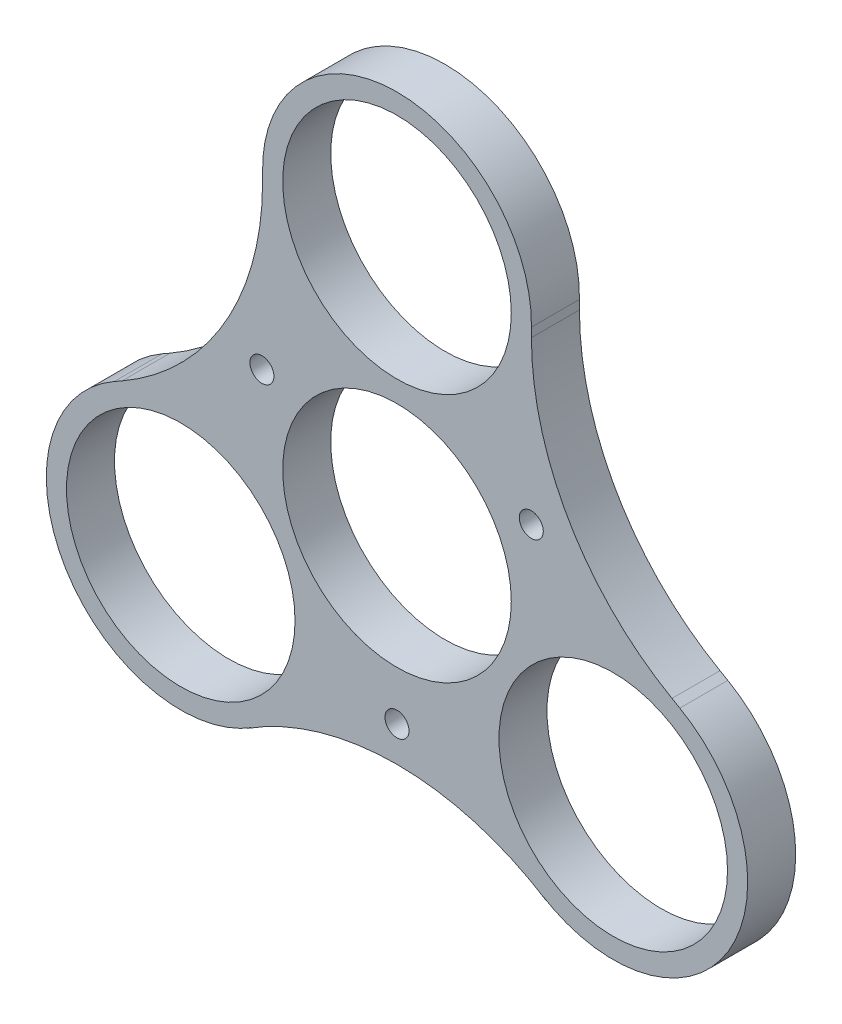
ISO-10303-21;
HEADER;
FILE_DESCRIPTION(('STEP AP214'),'2;1');
FILE_NAME('part.step','',(''),(''),'','','');
FILE_SCHEMA(('AUTOMOTIVE_DESIGN { 1 0 10303 214 1 1 1 1 }'));
ENDSEC;
DATA;
#1=APPLICATION_CONTEXT('core data for automotive mechanical design processes');
#2=APPLICATION_PROTOCOL_DEFINITION('international standard','automotive_design',2000,#1);
#3=PRODUCT_CONTEXT('',#1,'mechanical');
#4=PRODUCT('Part','Part','',(#3));
#5=PRODUCT_RELATED_PRODUCT_CATEGORY('part','',(#4));
#6=PRODUCT_DEFINITION_FORMATION('','',#4);
#7=PRODUCT_DEFINITION_CONTEXT('part definition',#1,'design');
#8=PRODUCT_DEFINITION('design','',#6,#7);
#9=PRODUCT_DEFINITION_SHAPE('','',#8);
#10=(LENGTH_UNIT() NAMED_UNIT(*) SI_UNIT(.MILLI.,.METRE.));
#11=(NAMED_UNIT(*) PLANE_ANGLE_UNIT() SI_UNIT($,.RADIAN.));
#12=(NAMED_UNIT(*) SI_UNIT($,.STERADIAN.) SOLID_ANGLE_UNIT());
#13=UNCERTAINTY_MEASURE_WITH_UNIT(LENGTH_MEASURE(1.E-05),#10,'distance_accuracy_value','');
#14=(GEOMETRIC_REPRESENTATION_CONTEXT(3) GLOBAL_UNCERTAINTY_ASSIGNED_CONTEXT((#13)) GLOBAL_UNIT_ASSIGNED_CONTEXT((#10,
#11,#12)) REPRESENTATION_CONTEXT('',''));
#15=CARTESIAN_POINT('',(0.,0.,0.));
#16=DIRECTION('',(0.,0.,1.));
#17=DIRECTION('',(1.,0.,0.));
#18=AXIS2_PLACEMENT_3D('',#15,#16,#17);
#19=CARTESIAN_POINT('',(0.,26.,2.5));
#20=DIRECTION('',(0.,0.,1.));
#21=DIRECTION('',(1.,0.,0.));
#22=AXIS2_PLACEMENT_3D('',#19,#20,#21);
#23=PLANE('',#22);
#24=CARTESIAN_POINT('',(0.,-17.,2.5));
#25=DIRECTION('',(0.,0.,1.));
#26=DIRECTION('',(1.,0.,0.));
#27=AXIS2_PLACEMENT_3D('',#24,#25,#26);
#28=CIRCLE('',#27,1.25);
#29=CARTESIAN_POINT('',(1.25,-17.,2.5));
#30=VERTEX_POINT('',#29);
#31=EDGE_CURVE('E303',#30,#30,#28,.T.);
#32=ORIENTED_EDGE('',*,*,#31,.F.);
#33=EDGE_LOOP('',(#32));
#34=FACE_BOUND('',#33,.T.);
#35=CARTESIAN_POINT('',(-22.5166604983954,-13.,2.5));
#36=DIRECTION('',(0.,0.,1.));
#37=DIRECTION('',(1.,0.,0.));
#38=AXIS2_PLACEMENT_3D('',#35,#36,#37);
#39=CIRCLE('',#38,11.9);
#40=CARTESIAN_POINT('',(-10.6166604983954,-13.,2.5));
#41=VERTEX_POINT('',#40);
#42=EDGE_CURVE('E315',#41,#41,#39,.T.);
#43=ORIENTED_EDGE('',*,*,#42,.F.);
#44=EDGE_LOOP('',(#43));
#45=FACE_BOUND('',#44,.T.);
#46=CARTESIAN_POINT('',(0.,26.,2.5));
#47=DIRECTION('',(0.,0.,1.));
#48=DIRECTION('',(1.,0.,0.));
#49=AXIS2_PLACEMENT_3D('',#46,#47,#48);
#50=CIRCLE('',#49,11.9);
#51=CARTESIAN_POINT('',(11.9,26.,2.5));
#52=VERTEX_POINT('',#51);
#53=EDGE_CURVE('E327',#52,#52,#50,.T.);
#54=ORIENTED_EDGE('',*,*,#53,.F.);
#55=EDGE_LOOP('',(#54));
#56=FACE_BOUND('',#55,.T.);
#57=CARTESIAN_POINT('',(0.,26.,2.5));
#58=DIRECTION('',(0.,0.,1.));
#59=DIRECTION('',(1.,0.,0.));
#60=AXIS2_PLACEMENT_3D('',#57,#58,#59);
#61=CIRCLE('',#60,14.);
#62=CARTESIAN_POINT('',(13.9984050341273,25.7886791526654,2.5));
#63=VERTEX_POINT('',#62);
#64=CARTESIAN_POINT('',(-13.9956292521166,25.650197430972,2.5));
#65=VERTEX_POINT('',#64);
#66=EDGE_CURVE('E177',#63,#65,#61,.T.);
#67=ORIENTED_EDGE('',*,*,#66,.T.);
#68=DIRECTION('',(-0.00391583470663836,-0.999992333089884,0.));
#69=VECTOR('',#68,1.);
#70=CARTESIAN_POINT('',(-13.9993244776974,24.7065423671787,2.5));
#71=LINE('',#70,#69);
#72=CARTESIAN_POINT('',(-13.9993244776975,24.7065423671787,2.5));
#73=VERTEX_POINT('',#72);
#74=EDGE_CURVE('E105',#65,#73,#71,.T.);
#75=ORIENTED_EDGE('',*,*,#74,.T.);
#76=CARTESIAN_POINT('',(-42.9991021373041,24.8201015736713,2.5));
#77=DIRECTION('',(0.,0.,-1.));
#78=DIRECTION('',(1.,0.,0.));
#79=AXIS2_PLACEMENT_3D('',#76,#77,#78);
#80=CIRCLE('',#79,29.);
#81=CARTESIAN_POINT('',(-28.6325234341284,-0.371194867073002,2.5));
#82=VERTEX_POINT('',#81);
#83=EDGE_CURVE('E204',#73,#82,#80,.T.);
#84=ORIENTED_EDGE('',*,*,#83,.T.);
#85=DIRECTION('',(-0.868665394508427,-0.495399265626746,0.));
#86=VECTOR('',#85,1.);
#87=CARTESIAN_POINT('',(-28.6325234341284,-0.371194867073002,2.5));
#88=LINE('',#87,#86);
#89=CARTESIAN_POINT('',(-29.4522502171699,-0.838684476881986,2.5));
#90=VERTEX_POINT('',#89);
#91=EDGE_CURVE('E223',#82,#90,#88,.T.);
#92=ORIENTED_EDGE('',*,*,#91,.T.);
#93=CARTESIAN_POINT('',(-22.5166604983954,-13.,2.5));
#94=DIRECTION('',(0.,0.,1.));
#95=DIRECTION('',(1.,0.,0.));
#96=AXIS2_PLACEMENT_3D('',#93,#94,#95);
#97=CIRCLE('',#96,14.);
#98=CARTESIAN_POINT('',(-14.9925927673296,-24.8062866633982,2.5));
#99=VERTEX_POINT('',#98);
#100=EDGE_CURVE('E220',#90,#99,#97,.T.);
#101=ORIENTED_EDGE('',*,*,#100,.T.);
#102=DIRECTION('',(-0.843306190242789,-0.537433409361749,0.));
#103=VECTOR('',#102,1.);
#104=CARTESIAN_POINT('',(-15.5855688714911,-25.1841863788477,2.5));
#105=LINE('',#104,#103);
#106=CARTESIAN_POINT('',(-15.5855688714911,-25.1841863788477,2.5));
#107=VERTEX_POINT('',#106);
#108=EDGE_CURVE('E222',#99,#107,#105,.T.);
#109=ORIENTED_EDGE('',*,*,#108,.T.);
#110=CARTESIAN_POINT('',(0.,-49.6400658958884,2.5));
#111=DIRECTION('',(0.,0.,-1.));
#112=DIRECTION('',(-1.,0.,0.));
#113=AXIS2_PLACEMENT_3D('',#110,#111,#112);
#114=CIRCLE('',#113,29.0000000000001);
#115=CARTESIAN_POINT('',(15.5855688714911,-25.1841863788477,2.5));
#116=VERTEX_POINT('',#115);
#117=EDGE_CURVE('E225',#107,#116,#114,.T.);
#118=ORIENTED_EDGE('',*,*,#117,.T.);
#119=DIRECTION('',(-0.843306190242782,0.53743340936176,0.));
#120=VECTOR('',#119,1.);
#121=CARTESIAN_POINT('',(15.5855688714911,-25.1841863788477,2.5));
#122=LINE('',#121,#120);
#123=CARTESIAN_POINT('',(14.9925927673308,-24.8062866633989,2.5));
#124=VERTEX_POINT('',#123);
#125=EDGE_CURVE('E231',#116,#124,#122,.T.);
#126=ORIENTED_EDGE('',*,*,#125,.T.);
#127=CARTESIAN_POINT('',(22.5166604983954,-12.9999999999999,2.5));
#128=DIRECTION('',(0.,0.,1.));
#129=DIRECTION('',(1.,0.,0.));
#130=AXIS2_PLACEMENT_3D('',#127,#128,#129);
#131=CIRCLE('',#130,14.);
#132=CARTESIAN_POINT('',(29.4517705843719,-0.838410955167509,2.5));
#133=VERTEX_POINT('',#132);
#134=EDGE_CURVE('E136',#124,#133,#131,.T.);
#135=ORIENTED_EDGE('',*,*,#134,.T.);
#136=DIRECTION('',(-0.868684931773746,0.495365006141171,0.));
#137=VECTOR('',#136,1.);
#138=CARTESIAN_POINT('',(28.6320253647497,-0.370953674743447,2.5));
#139=LINE('',#138,#137);
#140=CARTESIAN_POINT('',(28.6320253647497,-0.370953674743456,2.5));
#141=VERTEX_POINT('',#140);
#142=EDGE_CURVE('E130',#133,#141,#139,.T.);
#143=ORIENTED_EDGE('',*,*,#142,.T.);
#144=CARTESIAN_POINT('',(42.9976105428437,24.8209093466952,2.5));
#145=DIRECTION('',(0.,0.,-1.));
#146=DIRECTION('',(-1.,0.,0.));
#147=AXIS2_PLACEMENT_3D('',#144,#145,#146);
#148=CIRCLE('',#147,29.);
#149=CARTESIAN_POINT('',(13.9976205633218,24.8450171799652,2.5));
#150=VERTEX_POINT('',#149);
#151=EDGE_CURVE('E134',#141,#150,#148,.T.);
#152=ORIENTED_EDGE('',*,*,#151,.T.);
#153=DIRECTION('',(0.000831304595519707,0.999999654466275,0.));
#154=VECTOR('',#153,1.);
#155=CARTESIAN_POINT('',(13.9984050341273,25.7886791526654,2.5));
#156=LINE('',#155,#154);
#157=EDGE_CURVE('E50',#150,#63,#156,.T.);
#158=ORIENTED_EDGE('',*,*,#157,.T.);
#159=EDGE_LOOP('',(#67,#75,#84,#92,#101,#109,#118,#126,#135,#143,#152,#158));
#160=FACE_BOUND('',#159,.T.);
#161=CARTESIAN_POINT('',(0.,0.,2.5));
#162=DIRECTION('',(0.,0.,1.));
#163=DIRECTION('',(1.,0.,0.));
#164=AXIS2_PLACEMENT_3D('',#161,#162,#163);
#165=CIRCLE('',#164,11.9);
#166=CARTESIAN_POINT('',(11.9,0.,2.5));
#167=VERTEX_POINT('',#166);
#168=EDGE_CURVE('E158',#167,#167,#165,.T.);
#169=ORIENTED_EDGE('',*,*,#168,.F.);
#170=EDGE_LOOP('',(#169));
#171=FACE_BOUND('',#170,.T.);
#172=CARTESIAN_POINT('',(22.5166604983954,-12.9999999999999,2.5));
#173=DIRECTION('',(0.,0.,1.));
#174=DIRECTION('',(1.,0.,0.));
#175=AXIS2_PLACEMENT_3D('',#172,#173,#174);
#176=CIRCLE('',#175,11.9);
#177=CARTESIAN_POINT('',(34.4166604983955,-12.9999999999999,2.5));
#178=VERTEX_POINT('',#177);
#179=EDGE_CURVE('E321',#178,#178,#176,.T.);
#180=ORIENTED_EDGE('',*,*,#179,.F.);
#181=EDGE_LOOP('',(#180));
#182=FACE_BOUND('',#181,.T.);
#183=CARTESIAN_POINT('',(13.9836024759587,7.98226603570782,2.5));
#184=DIRECTION('',(0.,0.,1.));
#185=DIRECTION('',(1.,0.,0.));
#186=AXIS2_PLACEMENT_3D('',#183,#184,#185);
#187=CIRCLE('',#186,1.25);
#188=CARTESIAN_POINT('',(15.2336024759587,7.98226603570782,2.5));
#189=VERTEX_POINT('',#188);
#190=EDGE_CURVE('E309',#189,#189,#187,.T.);
#191=ORIENTED_EDGE('',*,*,#190,.F.);
#192=EDGE_LOOP('',(#191));
#193=FACE_BOUND('',#192,.T.);
#194=CARTESIAN_POINT('',(-14.064993078424,7.93665748417124,2.5));
#195=DIRECTION('',(0.,0.,1.));
#196=DIRECTION('',(1.,0.,0.));
#197=AXIS2_PLACEMENT_3D('',#194,#195,#196);
#198=CIRCLE('',#197,1.25);
#199=CARTESIAN_POINT('',(-12.814993078424,7.93665748417124,2.5));
#200=VERTEX_POINT('',#199);
#201=EDGE_CURVE('E294',#200,#200,#198,.T.);
#202=ORIENTED_EDGE('',*,*,#201,.F.);
#203=EDGE_LOOP('',(#202));
#204=FACE_BOUND('',#203,.T.);
#205=ADVANCED_FACE('F33',(#34,#45,#56,#160,#171,#182,#193,#204),#23,.T.);
#206=CARTESIAN_POINT('',(0.,26.,-2.5));
#207=DIRECTION('',(0.,0.,1.));
#208=DIRECTION('',(1.,0.,0.));
#209=AXIS2_PLACEMENT_3D('',#206,#207,#208);
#210=PLANE('',#209);
#211=CARTESIAN_POINT('',(0.,26.,-2.5));
#212=DIRECTION('',(0.,0.,1.));
#213=DIRECTION('',(1.,0.,0.));
#214=AXIS2_PLACEMENT_3D('',#211,#212,#213);
#215=CIRCLE('',#214,14.);
#216=CARTESIAN_POINT('',(13.9984050341273,25.7886791526654,-2.5));
#217=VERTEX_POINT('',#216);
#218=CARTESIAN_POINT('',(-13.9956292521166,25.650197430972,-2.5));
#219=VERTEX_POINT('',#218);
#220=EDGE_CURVE('E154',#217,#219,#215,.T.);
#221=ORIENTED_EDGE('',*,*,#220,.F.);
#222=DIRECTION('',(0.000831304595519707,0.999999654466275,0.));
#223=VECTOR('',#222,1.);
#224=CARTESIAN_POINT('',(13.9984050341273,25.7886791526654,-2.5));
#225=LINE('',#224,#223);
#226=CARTESIAN_POINT('',(13.9976205633218,24.8450171799652,-2.5));
#227=VERTEX_POINT('',#226);
#228=EDGE_CURVE('E97',#227,#217,#225,.T.);
#229=ORIENTED_EDGE('',*,*,#228,.F.);
#230=CARTESIAN_POINT('',(42.9976105428437,24.8209093466952,-2.5));
#231=DIRECTION('',(0.,0.,-1.));
#232=DIRECTION('',(-1.,0.,0.));
#233=AXIS2_PLACEMENT_3D('',#230,#231,#232);
#234=CIRCLE('',#233,29.);
#235=CARTESIAN_POINT('',(28.6320253647497,-0.370953674743456,-2.5));
#236=VERTEX_POINT('',#235);
#237=EDGE_CURVE('E91',#236,#227,#234,.T.);
#238=ORIENTED_EDGE('',*,*,#237,.F.);
#239=DIRECTION('',(-0.868684931773746,0.495365006141171,0.));
#240=VECTOR('',#239,1.);
#241=CARTESIAN_POINT('',(28.6320253647497,-0.370953674743447,-2.5));
#242=LINE('',#241,#240);
#243=CARTESIAN_POINT('',(29.4517705843719,-0.838410955167509,-2.5));
#244=VERTEX_POINT('',#243);
#245=EDGE_CURVE('E144',#244,#236,#242,.T.);
#246=ORIENTED_EDGE('',*,*,#245,.F.);
#247=CARTESIAN_POINT('',(22.5166604983954,-12.9999999999999,-2.5));
#248=DIRECTION('',(0.,0.,1.));
#249=DIRECTION('',(1.,0.,0.));
#250=AXIS2_PLACEMENT_3D('',#247,#248,#249);
#251=CIRCLE('',#250,14.);
#252=CARTESIAN_POINT('',(14.9925927673308,-24.8062866633989,-2.5));
#253=VERTEX_POINT('',#252);
#254=EDGE_CURVE('E172',#253,#244,#251,.T.);
#255=ORIENTED_EDGE('',*,*,#254,.F.);
#256=DIRECTION('',(-0.843306190242782,0.53743340936176,0.));
#257=VECTOR('',#256,1.);
#258=CARTESIAN_POINT('',(15.5855688714911,-25.1841863788477,-2.5));
#259=LINE('',#258,#257);
#260=CARTESIAN_POINT('',(15.5855688714911,-25.1841863788477,-2.5));
#261=VERTEX_POINT('',#260);
#262=EDGE_CURVE('E170',#261,#253,#259,.T.);
#263=ORIENTED_EDGE('',*,*,#262,.F.);
#264=CARTESIAN_POINT('',(0.,-49.6400658958884,-2.5));
#265=DIRECTION('',(0.,0.,-1.));
#266=DIRECTION('',(-1.,0.,0.));
#267=AXIS2_PLACEMENT_3D('',#264,#265,#266);
#268=CIRCLE('',#267,29.0000000000001);
#269=CARTESIAN_POINT('',(-15.5855688714911,-25.1841863788477,-2.5));
#270=VERTEX_POINT('',#269);
#271=EDGE_CURVE('E168',#270,#261,#268,.T.);
#272=ORIENTED_EDGE('',*,*,#271,.F.);
#273=DIRECTION('',(-0.843306190242789,-0.537433409361749,0.));
#274=VECTOR('',#273,1.);
#275=CARTESIAN_POINT('',(-15.5855688714911,-25.1841863788477,-2.5));
#276=LINE('',#275,#274);
#277=CARTESIAN_POINT('',(-14.9925927673296,-24.8062866633982,-2.5));
#278=VERTEX_POINT('',#277);
#279=EDGE_CURVE('E166',#278,#270,#276,.T.);
#280=ORIENTED_EDGE('',*,*,#279,.F.);
#281=CARTESIAN_POINT('',(-22.5166604983954,-13.,-2.5));
#282=DIRECTION('',(0.,0.,1.));
#283=DIRECTION('',(1.,0.,0.));
#284=AXIS2_PLACEMENT_3D('',#281,#282,#283);
#285=CIRCLE('',#284,14.);
#286=CARTESIAN_POINT('',(-29.4522502171699,-0.838684476881986,-2.5));
#287=VERTEX_POINT('',#286);
#288=EDGE_CURVE('E164',#287,#278,#285,.T.);
#289=ORIENTED_EDGE('',*,*,#288,.F.);
#290=DIRECTION('',(-0.868665394508427,-0.495399265626746,0.));
#291=VECTOR('',#290,1.);
#292=CARTESIAN_POINT('',(-28.6325234341284,-0.371194867073002,-2.5));
#293=LINE('',#292,#291);
#294=CARTESIAN_POINT('',(-28.6325234341284,-0.371194867073002,-2.5));
#295=VERTEX_POINT('',#294);
#296=EDGE_CURVE('E162',#295,#287,#293,.T.);
#297=ORIENTED_EDGE('',*,*,#296,.F.);
#298=CARTESIAN_POINT('',(-42.9991021373041,24.8201015736713,-2.5));
#299=DIRECTION('',(0.,0.,-1.));
#300=DIRECTION('',(1.,0.,0.));
#301=AXIS2_PLACEMENT_3D('',#298,#299,#300);
#302=CIRCLE('',#301,29.);
#303=CARTESIAN_POINT('',(-13.9993244776975,24.7065423671787,-2.5));
#304=VERTEX_POINT('',#303);
#305=EDGE_CURVE('E160',#304,#295,#302,.T.);
#306=ORIENTED_EDGE('',*,*,#305,.F.);
#307=DIRECTION('',(-0.00391583470663836,-0.999992333089884,0.));
#308=VECTOR('',#307,1.);
#309=CARTESIAN_POINT('',(-13.9993244776974,24.7065423671787,-2.5));
#310=LINE('',#309,#308);
#311=EDGE_CURVE('E157',#219,#304,#310,.T.);
#312=ORIENTED_EDGE('',*,*,#311,.F.);
#313=EDGE_LOOP('',(#221,#229,#238,#246,#255,#263,#272,#280,#289,#297,#306,#312));
#314=FACE_BOUND('',#313,.T.);
#315=CARTESIAN_POINT('',(0.,0.,-2.5));
#316=DIRECTION('',(0.,0.,1.));
#317=DIRECTION('',(1.,0.,0.));
#318=AXIS2_PLACEMENT_3D('',#315,#316,#317);
#319=CIRCLE('',#318,11.9);
#320=CARTESIAN_POINT('',(11.9,0.,-2.5));
#321=VERTEX_POINT('',#320);
#322=EDGE_CURVE('E330',#321,#321,#319,.T.);
#323=ORIENTED_EDGE('',*,*,#322,.T.);
#324=EDGE_LOOP('',(#323));
#325=FACE_BOUND('',#324,.T.);
#326=CARTESIAN_POINT('',(0.,26.,-2.5));
#327=DIRECTION('',(0.,0.,1.));
#328=DIRECTION('',(1.,0.,0.));
#329=AXIS2_PLACEMENT_3D('',#326,#327,#328);
#330=CIRCLE('',#329,11.9);
#331=CARTESIAN_POINT('',(11.9,26.,-2.5));
#332=VERTEX_POINT('',#331);
#333=EDGE_CURVE('E324',#332,#332,#330,.T.);
#334=ORIENTED_EDGE('',*,*,#333,.T.);
#335=EDGE_LOOP('',(#334));
#336=FACE_BOUND('',#335,.T.);
#337=CARTESIAN_POINT('',(22.5166604983954,-12.9999999999999,-2.5));
#338=DIRECTION('',(0.,0.,1.));
#339=DIRECTION('',(1.,0.,0.));
#340=AXIS2_PLACEMENT_3D('',#337,#338,#339);
#341=CIRCLE('',#340,11.9);
#342=CARTESIAN_POINT('',(34.4166604983955,-12.9999999999999,-2.5));
#343=VERTEX_POINT('',#342);
#344=EDGE_CURVE('E318',#343,#343,#341,.T.);
#345=ORIENTED_EDGE('',*,*,#344,.T.);
#346=EDGE_LOOP('',(#345));
#347=FACE_BOUND('',#346,.T.);
#348=CARTESIAN_POINT('',(-22.5166604983954,-13.,-2.5));
#349=DIRECTION('',(0.,0.,1.));
#350=DIRECTION('',(1.,0.,0.));
#351=AXIS2_PLACEMENT_3D('',#348,#349,#350);
#352=CIRCLE('',#351,11.9);
#353=CARTESIAN_POINT('',(-10.6166604983954,-13.,-2.5));
#354=VERTEX_POINT('',#353);
#355=EDGE_CURVE('E312',#354,#354,#352,.T.);
#356=ORIENTED_EDGE('',*,*,#355,.T.);
#357=EDGE_LOOP('',(#356));
#358=FACE_BOUND('',#357,.T.);
#359=CARTESIAN_POINT('',(13.9836024759587,7.98226603570782,-2.5));
#360=DIRECTION('',(0.,0.,1.));
#361=DIRECTION('',(1.,0.,0.));
#362=AXIS2_PLACEMENT_3D('',#359,#360,#361);
#363=CIRCLE('',#362,1.25);
#364=CARTESIAN_POINT('',(15.2336024759587,7.98226603570782,-2.5));
#365=VERTEX_POINT('',#364);
#366=EDGE_CURVE('E306',#365,#365,#363,.T.);
#367=ORIENTED_EDGE('',*,*,#366,.T.);
#368=EDGE_LOOP('',(#367));
#369=FACE_BOUND('',#368,.T.);
#370=CARTESIAN_POINT('',(0.,-17.,-2.5));
#371=DIRECTION('',(0.,0.,1.));
#372=DIRECTION('',(1.,0.,0.));
#373=AXIS2_PLACEMENT_3D('',#370,#371,#372);
#374=CIRCLE('',#373,1.25);
#375=CARTESIAN_POINT('',(1.25,-17.,-2.5));
#376=VERTEX_POINT('',#375);
#377=EDGE_CURVE('E300',#376,#376,#374,.T.);
#378=ORIENTED_EDGE('',*,*,#377,.T.);
#379=EDGE_LOOP('',(#378));
#380=FACE_BOUND('',#379,.T.);
#381=CARTESIAN_POINT('',(-14.064993078424,7.93665748417124,-2.5));
#382=DIRECTION('',(0.,0.,1.));
#383=DIRECTION('',(1.,0.,0.));
#384=AXIS2_PLACEMENT_3D('',#381,#382,#383);
#385=CIRCLE('',#384,1.25);
#386=CARTESIAN_POINT('',(-12.814993078424,7.93665748417124,-2.5));
#387=VERTEX_POINT('',#386);
#388=EDGE_CURVE('E297',#387,#387,#385,.T.);
#389=ORIENTED_EDGE('',*,*,#388,.T.);
#390=EDGE_LOOP('',(#389));
#391=FACE_BOUND('',#390,.T.);
#392=ADVANCED_FACE('F208',(#314,#325,#336,#347,#358,#369,#380,#391),#210,.F.);
#393=CARTESIAN_POINT('',(0.,26.,2.5));
#394=DIRECTION('',(0.,0.,-1.));
#395=DIRECTION('',(-1.,0.,0.));
#396=AXIS2_PLACEMENT_3D('',#393,#394,#395);
#397=CYLINDRICAL_SURFACE('',#396,14.);
#398=ORIENTED_EDGE('',*,*,#220,.T.);
#399=DIRECTION('',(0.,0.,-1.));
#400=VECTOR('',#399,1.);
#401=CARTESIAN_POINT('',(-13.9956292521166,25.650197430972,2.5));
#402=LINE('',#401,#400);
#403=EDGE_CURVE('E11',#65,#219,#402,.T.);
#404=ORIENTED_EDGE('',*,*,#403,.F.);
#405=ORIENTED_EDGE('',*,*,#66,.F.);
#406=DIRECTION('',(0.,0.,-1.));
#407=VECTOR('',#406,1.);
#408=CARTESIAN_POINT('',(13.9984050341273,25.7886791526654,2.5));
#409=LINE('',#408,#407);
#410=EDGE_CURVE('E150',#63,#217,#409,.T.);
#411=ORIENTED_EDGE('',*,*,#410,.T.);
#412=EDGE_LOOP('',(#398,#404,#405,#411));
#413=FACE_BOUND('',#412,.T.);
#414=ADVANCED_FACE('F35',(#413),#397,.T.);
#415=CARTESIAN_POINT('',(-13.9993244776974,24.7065423671787,2.5));
#416=DIRECTION('',(0.999992333089884,-0.00391583470663836,0.));
#417=DIRECTION('',(0.00391583470663836,0.999992333089885,0.));
#418=AXIS2_PLACEMENT_3D('',#415,#416,#417);
#419=PLANE('',#418);
#420=ORIENTED_EDGE('',*,*,#311,.T.);
#421=DIRECTION('',(0.,0.,-1.));
#422=VECTOR('',#421,1.);
#423=CARTESIAN_POINT('',(-13.9993244776975,24.7065423671787,2.5));
#424=LINE('',#423,#422);
#425=EDGE_CURVE('E42',#73,#304,#424,.T.);
#426=ORIENTED_EDGE('',*,*,#425,.F.);
#427=ORIENTED_EDGE('',*,*,#74,.F.);
#428=ORIENTED_EDGE('',*,*,#403,.T.);
#429=EDGE_LOOP('',(#420,#426,#427,#428));
#430=FACE_BOUND('',#429,.T.);
#431=ADVANCED_FACE('F467',(#430),#419,.F.);
#432=CARTESIAN_POINT('',(-42.9991021373041,24.8201015736713,2.5));
#433=DIRECTION('',(0.,0.,-1.));
#434=DIRECTION('',(-1.,0.,0.));
#435=AXIS2_PLACEMENT_3D('',#432,#433,#434);
#436=CYLINDRICAL_SURFACE('',#435,29.);
#437=ORIENTED_EDGE('',*,*,#305,.T.);
#438=DIRECTION('',(0.,0.,-1.));
#439=VECTOR('',#438,1.);
#440=CARTESIAN_POINT('',(-28.6325234341284,-0.371194867073002,2.5));
#441=LINE('',#440,#439);
#442=EDGE_CURVE('E196',#82,#295,#441,.T.);
#443=ORIENTED_EDGE('',*,*,#442,.F.);
#444=ORIENTED_EDGE('',*,*,#83,.F.);
#445=ORIENTED_EDGE('',*,*,#425,.T.);
#446=EDGE_LOOP('',(#437,#443,#444,#445));
#447=FACE_BOUND('',#446,.T.);
#448=ADVANCED_FACE('F202',(#447),#436,.F.);
#449=CARTESIAN_POINT('',(-28.6325234341284,-0.371194867073002,2.5));
#450=DIRECTION('',(0.495399265626746,-0.868665394508427,0.));
#451=DIRECTION('',(0.868665394508427,0.495399265626746,0.));
#452=AXIS2_PLACEMENT_3D('',#449,#450,#451);
#453=PLANE('',#452);
#454=ORIENTED_EDGE('',*,*,#296,.T.);
#455=DIRECTION('',(0.,0.,-1.));
#456=VECTOR('',#455,1.);
#457=CARTESIAN_POINT('',(-29.4522502171699,-0.838684476881986,2.5));
#458=LINE('',#457,#456);
#459=EDGE_CURVE('E193',#90,#287,#458,.T.);
#460=ORIENTED_EDGE('',*,*,#459,.F.);
#461=ORIENTED_EDGE('',*,*,#91,.F.);
#462=ORIENTED_EDGE('',*,*,#442,.T.);
#463=EDGE_LOOP('',(#454,#460,#461,#462));
#464=FACE_BOUND('',#463,.T.);
#465=ADVANCED_FACE('F214',(#464),#453,.F.);
#466=CARTESIAN_POINT('',(-22.5166604983954,-13.,2.5));
#467=DIRECTION('',(0.,0.,-1.));
#468=DIRECTION('',(-1.,0.,0.));
#469=AXIS2_PLACEMENT_3D('',#466,#467,#468);
#470=CYLINDRICAL_SURFACE('',#469,14.);
#471=ORIENTED_EDGE('',*,*,#288,.T.);
#472=DIRECTION('',(0.,0.,-1.));
#473=VECTOR('',#472,1.);
#474=CARTESIAN_POINT('',(-14.9925927673296,-24.8062866633982,2.5));
#475=LINE('',#474,#473);
#476=EDGE_CURVE('E190',#99,#278,#475,.T.);
#477=ORIENTED_EDGE('',*,*,#476,.F.);
#478=ORIENTED_EDGE('',*,*,#100,.F.);
#479=ORIENTED_EDGE('',*,*,#459,.T.);
#480=EDGE_LOOP('',(#471,#477,#478,#479));
#481=FACE_BOUND('',#480,.T.);
#482=ADVANCED_FACE('F218',(#481),#470,.T.);
#483=CARTESIAN_POINT('',(-15.5855688714911,-25.1841863788477,2.5));
#484=DIRECTION('',(0.537433409361749,-0.843306190242789,0.));
#485=DIRECTION('',(0.843306190242789,0.537433409361749,0.));
#486=AXIS2_PLACEMENT_3D('',#483,#484,#485);
#487=PLANE('',#486);
#488=ORIENTED_EDGE('',*,*,#279,.T.);
#489=DIRECTION('',(0.,0.,-1.));
#490=VECTOR('',#489,1.);
#491=CARTESIAN_POINT('',(-15.5855688714911,-25.1841863788477,2.5));
#492=LINE('',#491,#490);
#493=EDGE_CURVE('E187',#107,#270,#492,.T.);
#494=ORIENTED_EDGE('',*,*,#493,.F.);
#495=ORIENTED_EDGE('',*,*,#108,.F.);
#496=ORIENTED_EDGE('',*,*,#476,.T.);
#497=EDGE_LOOP('',(#488,#494,#495,#496));
#498=FACE_BOUND('',#497,.T.);
#499=ADVANCED_FACE('F432',(#498),#487,.F.);
#500=CARTESIAN_POINT('',(0.,-49.6400658958884,2.5));
#501=DIRECTION('',(0.,0.,-1.));
#502=DIRECTION('',(-1.,0.,0.));
#503=AXIS2_PLACEMENT_3D('',#500,#501,#502);
#504=CYLINDRICAL_SURFACE('',#503,29.0000000000001);
#505=ORIENTED_EDGE('',*,*,#271,.T.);
#506=DIRECTION('',(0.,0.,-1.));
#507=VECTOR('',#506,1.);
#508=CARTESIAN_POINT('',(15.5855688714911,-25.1841863788477,2.5));
#509=LINE('',#508,#507);
#510=EDGE_CURVE('E184',#116,#261,#509,.T.);
#511=ORIENTED_EDGE('',*,*,#510,.F.);
#512=ORIENTED_EDGE('',*,*,#117,.F.);
#513=ORIENTED_EDGE('',*,*,#493,.T.);
#514=EDGE_LOOP('',(#505,#511,#512,#513));
#515=FACE_BOUND('',#514,.T.);
#516=ADVANCED_FACE('F423',(#515),#504,.F.);
#517=CARTESIAN_POINT('',(15.5855688714911,-25.1841863788477,2.5));
#518=DIRECTION('',(-0.53743340936176,-0.843306190242782,0.));
#519=DIRECTION('',(0.843306190242782,-0.53743340936176,0.));
#520=AXIS2_PLACEMENT_3D('',#517,#518,#519);
#521=PLANE('',#520);
#522=ORIENTED_EDGE('',*,*,#262,.T.);
#523=DIRECTION('',(0.,0.,-1.));
#524=VECTOR('',#523,1.);
#525=CARTESIAN_POINT('',(14.9925927673308,-24.8062866633989,2.5));
#526=LINE('',#525,#524);
#527=EDGE_CURVE('E181',#124,#253,#526,.T.);
#528=ORIENTED_EDGE('',*,*,#527,.F.);
#529=ORIENTED_EDGE('',*,*,#125,.F.);
#530=ORIENTED_EDGE('',*,*,#510,.T.);
#531=EDGE_LOOP('',(#522,#528,#529,#530));
#532=FACE_BOUND('',#531,.T.);
#533=ADVANCED_FACE('F237',(#532),#521,.F.);
#534=CARTESIAN_POINT('',(22.5166604983954,-12.9999999999999,2.5));
#535=DIRECTION('',(0.,0.,-1.));
#536=DIRECTION('',(-1.,0.,0.));
#537=AXIS2_PLACEMENT_3D('',#534,#535,#536);
#538=CYLINDRICAL_SURFACE('',#537,14.);
#539=ORIENTED_EDGE('',*,*,#254,.T.);
#540=DIRECTION('',(0.,0.,-1.));
#541=VECTOR('',#540,1.);
#542=CARTESIAN_POINT('',(29.4517705843719,-0.838410955167509,2.5));
#543=LINE('',#542,#541);
#544=EDGE_CURVE('E145',#133,#244,#543,.T.);
#545=ORIENTED_EDGE('',*,*,#544,.F.);
#546=ORIENTED_EDGE('',*,*,#134,.F.);
#547=ORIENTED_EDGE('',*,*,#527,.T.);
#548=EDGE_LOOP('',(#539,#545,#546,#547));
#549=FACE_BOUND('',#548,.T.);
#550=ADVANCED_FACE('F241',(#549),#538,.T.);
#551=CARTESIAN_POINT('',(28.6320253647497,-0.370953674743447,2.5));
#552=DIRECTION('',(-0.495365006141171,-0.868684931773746,0.));
#553=DIRECTION('',(0.868684931773746,-0.495365006141171,0.));
#554=AXIS2_PLACEMENT_3D('',#551,#552,#553);
#555=PLANE('',#554);
#556=ORIENTED_EDGE('',*,*,#245,.T.);
#557=DIRECTION('',(0.,0.,-1.));
#558=VECTOR('',#557,1.);
#559=CARTESIAN_POINT('',(28.6320253647497,-0.370953674743456,2.5));
#560=LINE('',#559,#558);
#561=EDGE_CURVE('E141',#141,#236,#560,.T.);
#562=ORIENTED_EDGE('',*,*,#561,.F.);
#563=ORIENTED_EDGE('',*,*,#142,.F.);
#564=ORIENTED_EDGE('',*,*,#544,.T.);
#565=EDGE_LOOP('',(#556,#562,#563,#564));
#566=FACE_BOUND('',#565,.T.);
#567=ADVANCED_FACE('F142',(#566),#555,.F.);
#568=CARTESIAN_POINT('',(42.9976105428437,24.8209093466952,2.5));
#569=DIRECTION('',(0.,0.,-1.));
#570=DIRECTION('',(-1.,0.,0.));
#571=AXIS2_PLACEMENT_3D('',#568,#569,#570);
#572=CYLINDRICAL_SURFACE('',#571,29.);
#573=ORIENTED_EDGE('',*,*,#237,.T.);
#574=DIRECTION('',(0.,0.,-1.));
#575=VECTOR('',#574,1.);
#576=CARTESIAN_POINT('',(13.9976205633218,24.8450171799652,2.5));
#577=LINE('',#576,#575);
#578=EDGE_CURVE('E146',#150,#227,#577,.T.);
#579=ORIENTED_EDGE('',*,*,#578,.F.);
#580=ORIENTED_EDGE('',*,*,#151,.F.);
#581=ORIENTED_EDGE('',*,*,#561,.T.);
#582=EDGE_LOOP('',(#573,#579,#580,#581));
#583=FACE_BOUND('',#582,.T.);
#584=ADVANCED_FACE('F148',(#583),#572,.F.);
#585=CARTESIAN_POINT('',(13.9984050341273,25.7886791526654,2.5));
#586=DIRECTION('',(-0.999999654466275,0.000831304595519707,0.));
#587=DIRECTION('',(-0.000831304595519707,-0.999999654466275,0.));
#588=AXIS2_PLACEMENT_3D('',#585,#586,#587);
#589=PLANE('',#588);
#590=ORIENTED_EDGE('',*,*,#228,.T.);
#591=ORIENTED_EDGE('',*,*,#410,.F.);
#592=ORIENTED_EDGE('',*,*,#157,.F.);
#593=ORIENTED_EDGE('',*,*,#578,.T.);
#594=EDGE_LOOP('',(#590,#591,#592,#593));
#595=FACE_BOUND('',#594,.T.);
#596=ADVANCED_FACE('F245',(#595),#589,.F.);
#597=CARTESIAN_POINT('',(0.,0.,2.5));
#598=DIRECTION('',(0.,0.,-1.));
#599=DIRECTION('',(-1.,0.,0.));
#600=AXIS2_PLACEMENT_3D('',#597,#598,#599);
#601=CYLINDRICAL_SURFACE('',#600,11.9);
#602=ORIENTED_EDGE('',*,*,#168,.T.);
#603=EDGE_LOOP('',(#602));
#604=FACE_BOUND('',#603,.T.);
#605=ORIENTED_EDGE('',*,*,#322,.F.);
#606=EDGE_LOOP('',(#605));
#607=FACE_BOUND('',#606,.T.);
#608=ADVANCED_FACE('F247',(#604,#607),#601,.F.);
#609=CARTESIAN_POINT('',(0.,26.,2.5));
#610=DIRECTION('',(0.,0.,-1.));
#611=DIRECTION('',(-1.,0.,0.));
#612=AXIS2_PLACEMENT_3D('',#609,#610,#611);
#613=CYLINDRICAL_SURFACE('',#612,11.9);
#614=ORIENTED_EDGE('',*,*,#53,.T.);
#615=EDGE_LOOP('',(#614));
#616=FACE_BOUND('',#615,.T.);
#617=ORIENTED_EDGE('',*,*,#333,.F.);
#618=EDGE_LOOP('',(#617));
#619=FACE_BOUND('',#618,.T.);
#620=ADVANCED_FACE('F253',(#616,#619),#613,.F.);
#621=CARTESIAN_POINT('',(22.5166604983954,-12.9999999999999,2.5));
#622=DIRECTION('',(0.,0.,-1.));
#623=DIRECTION('',(-1.,0.,0.));
#624=AXIS2_PLACEMENT_3D('',#621,#622,#623);
#625=CYLINDRICAL_SURFACE('',#624,11.9);
#626=ORIENTED_EDGE('',*,*,#179,.T.);
#627=EDGE_LOOP('',(#626));
#628=FACE_BOUND('',#627,.T.);
#629=ORIENTED_EDGE('',*,*,#344,.F.);
#630=EDGE_LOOP('',(#629));
#631=FACE_BOUND('',#630,.T.);
#632=ADVANCED_FACE('F269',(#628,#631),#625,.F.);
#633=CARTESIAN_POINT('',(-22.5166604983954,-13.,2.5));
#634=DIRECTION('',(0.,0.,-1.));
#635=DIRECTION('',(-1.,0.,0.));
#636=AXIS2_PLACEMENT_3D('',#633,#634,#635);
#637=CYLINDRICAL_SURFACE('',#636,11.9);
#638=ORIENTED_EDGE('',*,*,#42,.T.);
#639=EDGE_LOOP('',(#638));
#640=FACE_BOUND('',#639,.T.);
#641=ORIENTED_EDGE('',*,*,#355,.F.);
#642=EDGE_LOOP('',(#641));
#643=FACE_BOUND('',#642,.T.);
#644=ADVANCED_FACE('F273',(#640,#643),#637,.F.);
#645=CARTESIAN_POINT('',(13.9836024759587,7.98226603570782,2.5));
#646=DIRECTION('',(0.,0.,-1.));
#647=DIRECTION('',(-1.,0.,0.));
#648=AXIS2_PLACEMENT_3D('',#645,#646,#647);
#649=CYLINDRICAL_SURFACE('',#648,1.25);
#650=ORIENTED_EDGE('',*,*,#190,.T.);
#651=EDGE_LOOP('',(#650));
#652=FACE_BOUND('',#651,.T.);
#653=ORIENTED_EDGE('',*,*,#366,.F.);
#654=EDGE_LOOP('',(#653));
#655=FACE_BOUND('',#654,.T.);
#656=ADVANCED_FACE('F277',(#652,#655),#649,.F.);
#657=CARTESIAN_POINT('',(0.,-17.,2.5));
#658=DIRECTION('',(0.,0.,-1.));
#659=DIRECTION('',(-1.,0.,0.));
#660=AXIS2_PLACEMENT_3D('',#657,#658,#659);
#661=CYLINDRICAL_SURFACE('',#660,1.25);
#662=ORIENTED_EDGE('',*,*,#31,.T.);
#663=EDGE_LOOP('',(#662));
#664=FACE_BOUND('',#663,.T.);
#665=ORIENTED_EDGE('',*,*,#377,.F.);
#666=EDGE_LOOP('',(#665));
#667=FACE_BOUND('',#666,.T.);
#668=ADVANCED_FACE('F281',(#664,#667),#661,.F.);
#669=CARTESIAN_POINT('',(-14.064993078424,7.93665748417124,2.5));
#670=DIRECTION('',(0.,0.,-1.));
#671=DIRECTION('',(-1.,0.,0.));
#672=AXIS2_PLACEMENT_3D('',#669,#670,#671);
#673=CYLINDRICAL_SURFACE('',#672,1.25);
#674=ORIENTED_EDGE('',*,*,#201,.T.);
#675=EDGE_LOOP('',(#674));
#676=FACE_BOUND('',#675,.T.);
#677=ORIENTED_EDGE('',*,*,#388,.F.);
#678=EDGE_LOOP('',(#677));
#679=FACE_BOUND('',#678,.T.);
#680=ADVANCED_FACE('F285',(#676,#679),#673,.F.);
#681=CLOSED_SHELL('',(#205,#392,#414,#431,#448,#465,#482,#499,#516,#533,#550,#567,#584,#596,
#608,#620,#632,#644,#656,#668,#680));
#682=MANIFOLD_SOLID_BREP('B2',#681);
#683=ADVANCED_BREP_SHAPE_REPRESENTATION('',(#18,#682),#14);
#684=SHAPE_DEFINITION_REPRESENTATION(#9,#683);
ENDSEC;
END-ISO-10303-21;
